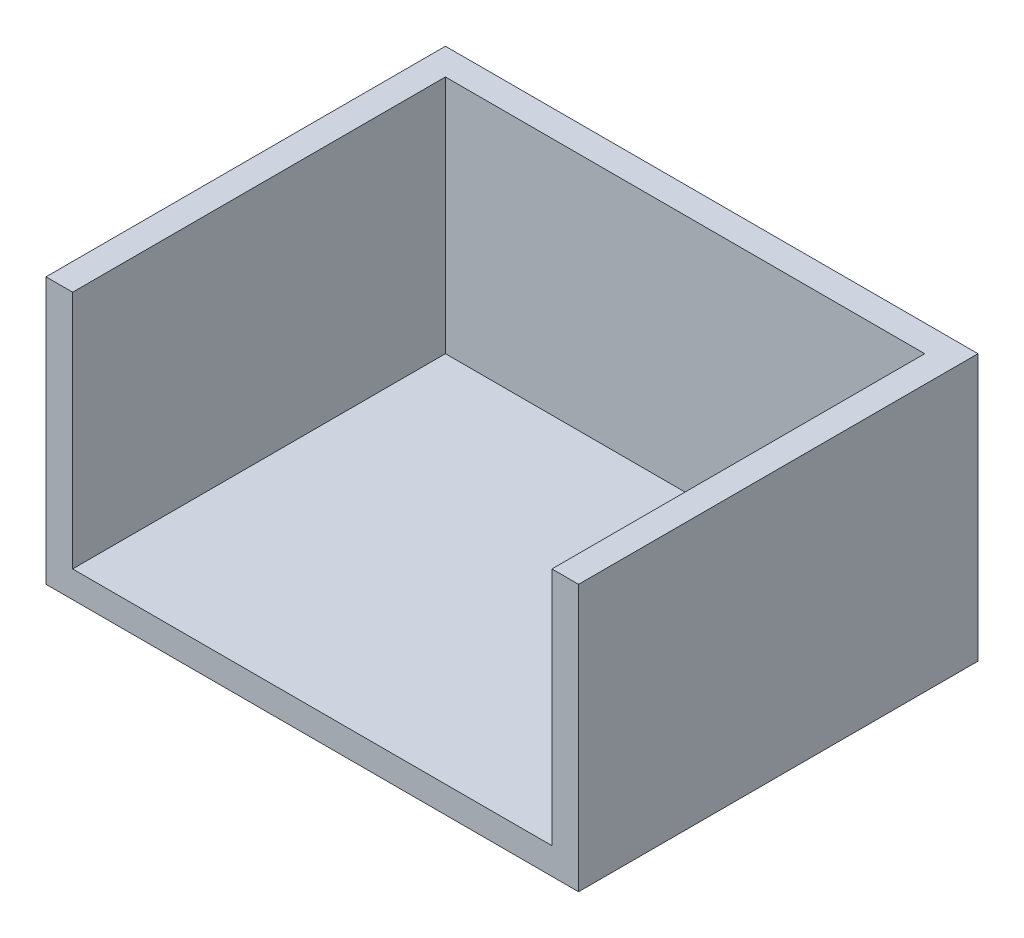
ISO-10303-21;
HEADER;
FILE_DESCRIPTION(('STEP AP214'),'2;1');
FILE_NAME('part.step','',(''),(''),'','','');
FILE_SCHEMA(('AUTOMOTIVE_DESIGN { 1 0 10303 214 1 1 1 1 }'));
ENDSEC;
DATA;
#1=APPLICATION_CONTEXT('core data for automotive mechanical design processes');
#2=APPLICATION_PROTOCOL_DEFINITION('international standard','automotive_design',2000,#1);
#3=PRODUCT_CONTEXT('',#1,'mechanical');
#4=PRODUCT('Part','Part','',(#3));
#5=PRODUCT_RELATED_PRODUCT_CATEGORY('part','',(#4));
#6=PRODUCT_DEFINITION_FORMATION('','',#4);
#7=PRODUCT_DEFINITION_CONTEXT('part definition',#1,'design');
#8=PRODUCT_DEFINITION('design','',#6,#7);
#9=PRODUCT_DEFINITION_SHAPE('','',#8);
#10=(LENGTH_UNIT() NAMED_UNIT(*) SI_UNIT(.MILLI.,.METRE.));
#11=(NAMED_UNIT(*) PLANE_ANGLE_UNIT() SI_UNIT($,.RADIAN.));
#12=(NAMED_UNIT(*) SI_UNIT($,.STERADIAN.) SOLID_ANGLE_UNIT());
#13=UNCERTAINTY_MEASURE_WITH_UNIT(LENGTH_MEASURE(1.E-05),#10,'distance_accuracy_value','');
#14=(GEOMETRIC_REPRESENTATION_CONTEXT(3) GLOBAL_UNCERTAINTY_ASSIGNED_CONTEXT((#13)) GLOBAL_UNIT_ASSIGNED_CONTEXT((#10,
#11,#12)) REPRESENTATION_CONTEXT('',''));
#15=CARTESIAN_POINT('',(0.,0.,0.));
#16=DIRECTION('',(0.,0.,1.));
#17=DIRECTION('',(1.,0.,0.));
#18=AXIS2_PLACEMENT_3D('',#15,#16,#17);
#19=CARTESIAN_POINT('',(-50.8,25.4,-38.1));
#20=DIRECTION('',(1.,0.,0.));
#21=DIRECTION('',(0.,0.,-1.));
#22=AXIS2_PLACEMENT_3D('',#19,#20,#21);
#23=PLANE('',#22);
#24=DIRECTION('',(0.,0.,1.));
#25=VECTOR('',#24,1.);
#26=CARTESIAN_POINT('',(-50.8,-25.4,-38.1));
#27=LINE('',#26,#25);
#28=CARTESIAN_POINT('',(-50.8,-25.4,-38.1));
#29=VERTEX_POINT('',#28);
#30=CARTESIAN_POINT('',(-50.8,-25.4,38.1));
#31=VERTEX_POINT('',#30);
#32=EDGE_CURVE('E143',#29,#31,#27,.T.);
#33=ORIENTED_EDGE('',*,*,#32,.T.);
#34=DIRECTION('',(0.,-1.,0.));
#35=VECTOR('',#34,1.);
#36=CARTESIAN_POINT('',(-50.8,25.4,38.1));
#37=LINE('',#36,#35);
#38=CARTESIAN_POINT('',(-50.8,25.4,38.1));
#39=VERTEX_POINT('',#38);
#40=EDGE_CURVE('E11',#39,#31,#37,.T.);
#41=ORIENTED_EDGE('',*,*,#40,.F.);
#42=DIRECTION('',(0.,0.,1.));
#43=VECTOR('',#42,1.);
#44=CARTESIAN_POINT('',(-50.8,25.4,-38.1));
#45=LINE('',#44,#43);
#46=CARTESIAN_POINT('',(-50.8,25.4,-38.1));
#47=VERTEX_POINT('',#46);
#48=EDGE_CURVE('E151',#47,#39,#45,.T.);
#49=ORIENTED_EDGE('',*,*,#48,.F.);
#50=DIRECTION('',(0.,-1.,0.));
#51=VECTOR('',#50,1.);
#52=CARTESIAN_POINT('',(-50.8,25.4,-38.1));
#53=LINE('',#52,#51);
#54=EDGE_CURVE('E158',#47,#29,#53,.T.);
#55=ORIENTED_EDGE('',*,*,#54,.T.);
#56=EDGE_LOOP('',(#33,#41,#49,#55));
#57=FACE_BOUND('',#56,.T.);
#58=ADVANCED_FACE('F42',(#57),#23,.F.);
#59=CARTESIAN_POINT('',(-50.8,25.4,38.1));
#60=DIRECTION('',(0.,0.,-1.));
#61=DIRECTION('',(-1.,0.,0.));
#62=AXIS2_PLACEMENT_3D('',#59,#60,#61);
#63=PLANE('',#62);
#64=DIRECTION('',(1.,0.,0.));
#65=VECTOR('',#64,1.);
#66=CARTESIAN_POINT('',(-50.8,25.4,38.1));
#67=LINE('',#66,#65);
#68=CARTESIAN_POINT('',(45.72,25.4,38.1));
#69=VERTEX_POINT('',#68);
#70=CARTESIAN_POINT('',(50.8,25.4,38.1));
#71=VERTEX_POINT('',#70);
#72=EDGE_CURVE('E153',#69,#71,#67,.T.);
#73=ORIENTED_EDGE('',*,*,#72,.F.);
#74=DIRECTION('',(0.,-1.,0.));
#75=VECTOR('',#74,1.);
#76=CARTESIAN_POINT('',(45.72,25.4,38.1));
#77=LINE('',#76,#75);
#78=CARTESIAN_POINT('',(45.72,-20.32,38.1));
#79=VERTEX_POINT('',#78);
#80=EDGE_CURVE('E141',#69,#79,#77,.T.);
#81=ORIENTED_EDGE('',*,*,#80,.T.);
#82=DIRECTION('',(1.,0.,0.));
#83=VECTOR('',#82,1.);
#84=CARTESIAN_POINT('',(-50.8,-20.32,38.1));
#85=LINE('',#84,#83);
#86=CARTESIAN_POINT('',(-45.72,-20.32,38.1));
#87=VERTEX_POINT('',#86);
#88=EDGE_CURVE('E136',#87,#79,#85,.T.);
#89=ORIENTED_EDGE('',*,*,#88,.F.);
#90=DIRECTION('',(0.,-1.,0.));
#91=VECTOR('',#90,1.);
#92=CARTESIAN_POINT('',(-45.72,25.4,38.1));
#93=LINE('',#92,#91);
#94=CARTESIAN_POINT('',(-45.72,25.4,38.1));
#95=VERTEX_POINT('',#94);
#96=EDGE_CURVE('E135',#95,#87,#93,.T.);
#97=ORIENTED_EDGE('',*,*,#96,.F.);
#98=EDGE_CURVE('E93',#39,#95,#67,.T.);
#99=ORIENTED_EDGE('',*,*,#98,.F.);
#100=ORIENTED_EDGE('',*,*,#40,.T.);
#101=DIRECTION('',(1.,0.,0.));
#102=VECTOR('',#101,1.);
#103=CARTESIAN_POINT('',(-50.8,-25.4,38.1));
#104=LINE('',#103,#102);
#105=CARTESIAN_POINT('',(50.8,-25.4,38.1));
#106=VERTEX_POINT('',#105);
#107=EDGE_CURVE('E161',#31,#106,#104,.T.);
#108=ORIENTED_EDGE('',*,*,#107,.T.);
#109=DIRECTION('',(0.,-1.,0.));
#110=VECTOR('',#109,1.);
#111=CARTESIAN_POINT('',(50.8,25.4,38.1));
#112=LINE('',#111,#110);
#113=EDGE_CURVE('E49',#71,#106,#112,.T.);
#114=ORIENTED_EDGE('',*,*,#113,.F.);
#115=EDGE_LOOP('',(#73,#81,#89,#97,#99,#100,#108,#114));
#116=FACE_BOUND('',#115,.T.);
#117=ADVANCED_FACE('F192',(#116),#63,.F.);
#118=CARTESIAN_POINT('',(50.8,25.4,-38.1));
#119=DIRECTION('',(-1.,0.,0.));
#120=DIRECTION('',(0.,0.,1.));
#121=AXIS2_PLACEMENT_3D('',#118,#119,#120);
#122=PLANE('',#121);
#123=DIRECTION('',(0.,0.,-1.));
#124=VECTOR('',#123,1.);
#125=CARTESIAN_POINT('',(50.8,-25.4,-38.1));
#126=LINE('',#125,#124);
#127=CARTESIAN_POINT('',(50.8,-25.4,-38.1));
#128=VERTEX_POINT('',#127);
#129=EDGE_CURVE('E163',#106,#128,#126,.T.);
#130=ORIENTED_EDGE('',*,*,#129,.T.);
#131=DIRECTION('',(0.,-1.,0.));
#132=VECTOR('',#131,1.);
#133=CARTESIAN_POINT('',(50.8,25.4,-38.1));
#134=LINE('',#133,#132);
#135=CARTESIAN_POINT('',(50.8,25.4,-38.1));
#136=VERTEX_POINT('',#135);
#137=EDGE_CURVE('E167',#136,#128,#134,.T.);
#138=ORIENTED_EDGE('',*,*,#137,.F.);
#139=DIRECTION('',(0.,0.,-1.));
#140=VECTOR('',#139,1.);
#141=CARTESIAN_POINT('',(50.8,25.4,-38.1));
#142=LINE('',#141,#140);
#143=EDGE_CURVE('E155',#71,#136,#142,.T.);
#144=ORIENTED_EDGE('',*,*,#143,.F.);
#145=ORIENTED_EDGE('',*,*,#113,.T.);
#146=EDGE_LOOP('',(#130,#138,#144,#145));
#147=FACE_BOUND('',#146,.T.);
#148=ADVANCED_FACE('F173',(#147),#122,.F.);
#149=CARTESIAN_POINT('',(-50.8,25.4,-38.1));
#150=DIRECTION('',(0.,0.,1.));
#151=DIRECTION('',(1.,0.,0.));
#152=AXIS2_PLACEMENT_3D('',#149,#150,#151);
#153=PLANE('',#152);
#154=DIRECTION('',(-1.,0.,0.));
#155=VECTOR('',#154,1.);
#156=CARTESIAN_POINT('',(-50.8,-25.4,-38.1));
#157=LINE('',#156,#155);
#158=EDGE_CURVE('E86',#128,#29,#157,.T.);
#159=ORIENTED_EDGE('',*,*,#158,.T.);
#160=ORIENTED_EDGE('',*,*,#54,.F.);
#161=DIRECTION('',(-1.,0.,0.));
#162=VECTOR('',#161,1.);
#163=CARTESIAN_POINT('',(-50.8,25.4,-38.1));
#164=LINE('',#163,#162);
#165=EDGE_CURVE('E65',#136,#47,#164,.T.);
#166=ORIENTED_EDGE('',*,*,#165,.F.);
#167=ORIENTED_EDGE('',*,*,#137,.T.);
#168=EDGE_LOOP('',(#159,#160,#166,#167));
#169=FACE_BOUND('',#168,.T.);
#170=ADVANCED_FACE('F182',(#169),#153,.F.);
#171=CARTESIAN_POINT('',(0.,25.4,0.));
#172=DIRECTION('',(0.,1.,0.));
#173=DIRECTION('',(0.,0.,1.));
#174=AXIS2_PLACEMENT_3D('',#171,#172,#173);
#175=PLANE('',#174);
#176=DIRECTION('',(0.,0.,1.));
#177=VECTOR('',#176,1.);
#178=CARTESIAN_POINT('',(-45.72,25.4,-38.1));
#179=LINE('',#178,#177);
#180=CARTESIAN_POINT('',(-45.72,25.4,-33.02));
#181=VERTEX_POINT('',#180);
#182=EDGE_CURVE('E124',#181,#95,#179,.T.);
#183=ORIENTED_EDGE('',*,*,#182,.F.);
#184=DIRECTION('',(-1.,0.,0.));
#185=VECTOR('',#184,1.);
#186=CARTESIAN_POINT('',(-50.8,25.4,-33.02));
#187=LINE('',#186,#185);
#188=CARTESIAN_POINT('',(45.72,25.4,-33.02));
#189=VERTEX_POINT('',#188);
#190=EDGE_CURVE('E130',#189,#181,#187,.T.);
#191=ORIENTED_EDGE('',*,*,#190,.F.);
#192=DIRECTION('',(0.,0.,-1.));
#193=VECTOR('',#192,1.);
#194=CARTESIAN_POINT('',(45.72,25.4,-38.1));
#195=LINE('',#194,#193);
#196=EDGE_CURVE('E147',#69,#189,#195,.T.);
#197=ORIENTED_EDGE('',*,*,#196,.F.);
#198=ORIENTED_EDGE('',*,*,#72,.T.);
#199=ORIENTED_EDGE('',*,*,#143,.T.);
#200=ORIENTED_EDGE('',*,*,#165,.T.);
#201=ORIENTED_EDGE('',*,*,#48,.T.);
#202=ORIENTED_EDGE('',*,*,#98,.T.);
#203=EDGE_LOOP('',(#183,#191,#197,#198,#199,#200,#201,#202));
#204=FACE_BOUND('',#203,.T.);
#205=ADVANCED_FACE('F184',(#204),#175,.T.);
#206=CARTESIAN_POINT('',(0.,-25.4,0.));
#207=DIRECTION('',(0.,1.,0.));
#208=DIRECTION('',(0.,0.,1.));
#209=AXIS2_PLACEMENT_3D('',#206,#207,#208);
#210=PLANE('',#209);
#211=ORIENTED_EDGE('',*,*,#32,.F.);
#212=ORIENTED_EDGE('',*,*,#158,.F.);
#213=ORIENTED_EDGE('',*,*,#129,.F.);
#214=ORIENTED_EDGE('',*,*,#107,.F.);
#215=EDGE_LOOP('',(#211,#212,#213,#214));
#216=FACE_BOUND('',#215,.T.);
#217=ADVANCED_FACE('F178',(#216),#210,.F.);
#218=CARTESIAN_POINT('',(-45.72,25.4,-38.1));
#219=DIRECTION('',(1.,0.,0.));
#220=DIRECTION('',(0.,0.,-1.));
#221=AXIS2_PLACEMENT_3D('',#218,#219,#220);
#222=PLANE('',#221);
#223=DIRECTION('',(0.,0.,1.));
#224=VECTOR('',#223,1.);
#225=CARTESIAN_POINT('',(-45.72,-20.32,-38.1));
#226=LINE('',#225,#224);
#227=CARTESIAN_POINT('',(-45.72,-20.32,-33.02));
#228=VERTEX_POINT('',#227);
#229=EDGE_CURVE('E120',#228,#87,#226,.T.);
#230=ORIENTED_EDGE('',*,*,#229,.F.);
#231=DIRECTION('',(0.,-1.,0.));
#232=VECTOR('',#231,1.);
#233=CARTESIAN_POINT('',(-45.72,25.4,-33.02));
#234=LINE('',#233,#232);
#235=EDGE_CURVE('E127',#181,#228,#234,.T.);
#236=ORIENTED_EDGE('',*,*,#235,.F.);
#237=ORIENTED_EDGE('',*,*,#182,.T.);
#238=ORIENTED_EDGE('',*,*,#96,.T.);
#239=EDGE_LOOP('',(#230,#236,#237,#238));
#240=FACE_BOUND('',#239,.T.);
#241=ADVANCED_FACE('F134',(#240),#222,.T.);
#242=CARTESIAN_POINT('',(45.72,25.4,-38.1));
#243=DIRECTION('',(-1.,0.,0.));
#244=DIRECTION('',(0.,0.,1.));
#245=AXIS2_PLACEMENT_3D('',#242,#243,#244);
#246=PLANE('',#245);
#247=DIRECTION('',(0.,0.,-1.));
#248=VECTOR('',#247,1.);
#249=CARTESIAN_POINT('',(45.72,-20.32,-38.1));
#250=LINE('',#249,#248);
#251=CARTESIAN_POINT('',(45.72,-20.32,-33.02));
#252=VERTEX_POINT('',#251);
#253=EDGE_CURVE('E123',#79,#252,#250,.T.);
#254=ORIENTED_EDGE('',*,*,#253,.F.);
#255=ORIENTED_EDGE('',*,*,#80,.F.);
#256=ORIENTED_EDGE('',*,*,#196,.T.);
#257=DIRECTION('',(0.,-1.,0.));
#258=VECTOR('',#257,1.);
#259=CARTESIAN_POINT('',(45.72,25.4,-33.02));
#260=LINE('',#259,#258);
#261=EDGE_CURVE('E56',#189,#252,#260,.T.);
#262=ORIENTED_EDGE('',*,*,#261,.T.);
#263=EDGE_LOOP('',(#254,#255,#256,#262));
#264=FACE_BOUND('',#263,.T.);
#265=ADVANCED_FACE('F203',(#264),#246,.T.);
#266=CARTESIAN_POINT('',(-50.8,25.4,-33.02));
#267=DIRECTION('',(0.,0.,1.));
#268=DIRECTION('',(1.,0.,0.));
#269=AXIS2_PLACEMENT_3D('',#266,#267,#268);
#270=PLANE('',#269);
#271=DIRECTION('',(-1.,0.,0.));
#272=VECTOR('',#271,1.);
#273=CARTESIAN_POINT('',(-50.8,-20.32,-33.02));
#274=LINE('',#273,#272);
#275=EDGE_CURVE('E116',#252,#228,#274,.T.);
#276=ORIENTED_EDGE('',*,*,#275,.F.);
#277=ORIENTED_EDGE('',*,*,#261,.F.);
#278=ORIENTED_EDGE('',*,*,#190,.T.);
#279=ORIENTED_EDGE('',*,*,#235,.T.);
#280=EDGE_LOOP('',(#276,#277,#278,#279));
#281=FACE_BOUND('',#280,.T.);
#282=ADVANCED_FACE('F128',(#281),#270,.T.);
#283=CARTESIAN_POINT('',(0.,-20.32,0.));
#284=DIRECTION('',(0.,1.,0.));
#285=DIRECTION('',(0.,0.,1.));
#286=AXIS2_PLACEMENT_3D('',#283,#284,#285);
#287=PLANE('',#286);
#288=ORIENTED_EDGE('',*,*,#229,.T.);
#289=ORIENTED_EDGE('',*,*,#88,.T.);
#290=ORIENTED_EDGE('',*,*,#253,.T.);
#291=ORIENTED_EDGE('',*,*,#275,.T.);
#292=EDGE_LOOP('',(#288,#289,#290,#291));
#293=FACE_BOUND('',#292,.T.);
#294=ADVANCED_FACE('F118',(#293),#287,.T.);
#295=CLOSED_SHELL('',(#58,#117,#148,#170,#205,#217,#241,#265,#282,#294));
#296=MANIFOLD_SOLID_BREP('B2',#295);
#297=ADVANCED_BREP_SHAPE_REPRESENTATION('',(#18,#296),#14);
#298=SHAPE_DEFINITION_REPRESENTATION(#9,#297);
ENDSEC;
END-ISO-10303-21;
